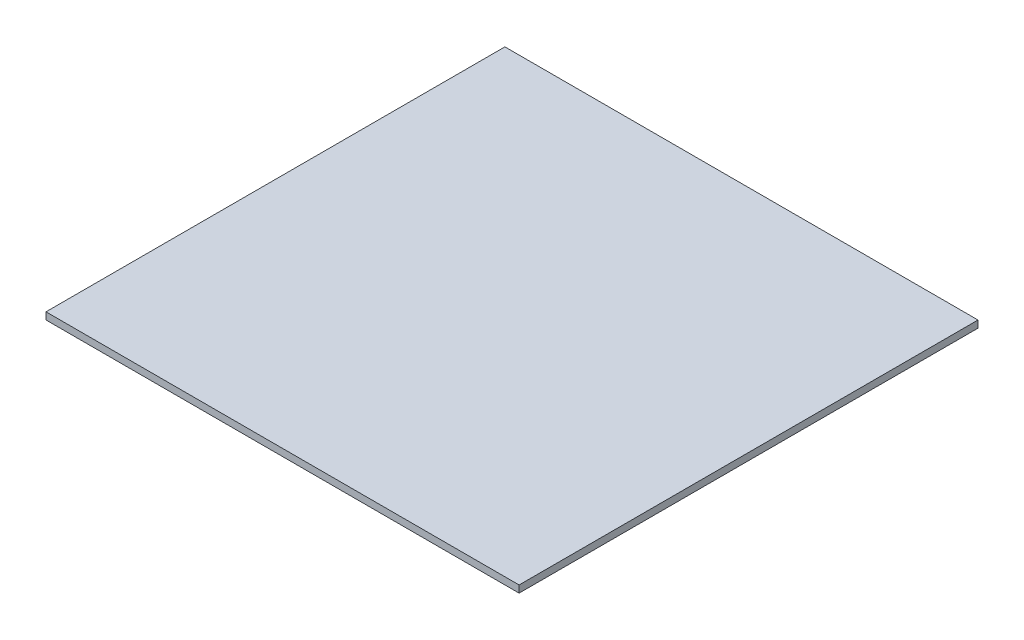
ISO-10303-21;
HEADER;
FILE_DESCRIPTION(('STEP AP214'),'2;1');
FILE_NAME('part.step','',(''),(''),'','','');
FILE_SCHEMA(('AUTOMOTIVE_DESIGN { 1 0 10303 214 1 1 1 1 }'));
ENDSEC;
DATA;
#1=APPLICATION_CONTEXT('core data for automotive mechanical design processes');
#2=APPLICATION_PROTOCOL_DEFINITION('international standard','automotive_design',2000,#1);
#3=PRODUCT_CONTEXT('',#1,'mechanical');
#4=PRODUCT('Part','Part','',(#3));
#5=PRODUCT_RELATED_PRODUCT_CATEGORY('part','',(#4));
#6=PRODUCT_DEFINITION_FORMATION('','',#4);
#7=PRODUCT_DEFINITION_CONTEXT('part definition',#1,'design');
#8=PRODUCT_DEFINITION('design','',#6,#7);
#9=PRODUCT_DEFINITION_SHAPE('','',#8);
#10=(LENGTH_UNIT() NAMED_UNIT(*) SI_UNIT(.MILLI.,.METRE.));
#11=(NAMED_UNIT(*) PLANE_ANGLE_UNIT() SI_UNIT($,.RADIAN.));
#12=(NAMED_UNIT(*) SI_UNIT($,.STERADIAN.) SOLID_ANGLE_UNIT());
#13=UNCERTAINTY_MEASURE_WITH_UNIT(LENGTH_MEASURE(1.E-05),#10,'distance_accuracy_value','');
#14=(GEOMETRIC_REPRESENTATION_CONTEXT(3) GLOBAL_UNCERTAINTY_ASSIGNED_CONTEXT((#13)) GLOBAL_UNIT_ASSIGNED_CONTEXT((#10,
#11,#12)) REPRESENTATION_CONTEXT('',''));
#15=CARTESIAN_POINT('',(0.,0.,0.));
#16=DIRECTION('',(0.,0.,1.));
#17=DIRECTION('',(1.,0.,0.));
#18=AXIS2_PLACEMENT_3D('',#15,#16,#17);
#19=CARTESIAN_POINT('',(0.,3.,0.));
#20=DIRECTION('',(1.,0.,0.));
#21=DIRECTION('',(0.,0.,-1.));
#22=AXIS2_PLACEMENT_3D('',#19,#20,#21);
#23=PLANE('',#22);
#24=DIRECTION('',(0.,0.,1.));
#25=VECTOR('',#24,1.);
#26=CARTESIAN_POINT('',(0.,0.,0.));
#27=LINE('',#26,#25);
#28=CARTESIAN_POINT('',(0.,0.,0.));
#29=VERTEX_POINT('',#28);
#30=CARTESIAN_POINT('',(0.,0.,194.));
#31=VERTEX_POINT('',#30);
#32=EDGE_CURVE('E119',#29,#31,#27,.T.);
#33=ORIENTED_EDGE('',*,*,#32,.T.);
#34=DIRECTION('',(0.,-1.,0.));
#35=VECTOR('',#34,1.);
#36=CARTESIAN_POINT('',(0.,3.,194.));
#37=LINE('',#36,#35);
#38=CARTESIAN_POINT('',(0.,3.,194.));
#39=VERTEX_POINT('',#38);
#40=EDGE_CURVE('E11',#39,#31,#37,.T.);
#41=ORIENTED_EDGE('',*,*,#40,.F.);
#42=DIRECTION('',(0.,0.,1.));
#43=VECTOR('',#42,1.);
#44=CARTESIAN_POINT('',(0.,3.,0.));
#45=LINE('',#44,#43);
#46=CARTESIAN_POINT('',(0.,3.,0.));
#47=VERTEX_POINT('',#46);
#48=EDGE_CURVE('E103',#47,#39,#45,.T.);
#49=ORIENTED_EDGE('',*,*,#48,.F.);
#50=DIRECTION('',(0.,-1.,0.));
#51=VECTOR('',#50,1.);
#52=CARTESIAN_POINT('',(0.,3.,0.));
#53=LINE('',#52,#51);
#54=EDGE_CURVE('E115',#47,#29,#53,.T.);
#55=ORIENTED_EDGE('',*,*,#54,.T.);
#56=EDGE_LOOP('',(#33,#41,#49,#55));
#57=FACE_BOUND('',#56,.T.);
#58=ADVANCED_FACE('F51',(#57),#23,.F.);
#59=CARTESIAN_POINT('',(0.,3.,194.));
#60=DIRECTION('',(0.,0.,-1.));
#61=DIRECTION('',(-1.,0.,0.));
#62=AXIS2_PLACEMENT_3D('',#59,#60,#61);
#63=PLANE('',#62);
#64=DIRECTION('',(1.,0.,0.));
#65=VECTOR('',#64,1.);
#66=CARTESIAN_POINT('',(0.,0.,194.));
#67=LINE('',#66,#65);
#68=CARTESIAN_POINT('',(200.,0.,194.));
#69=VERTEX_POINT('',#68);
#70=EDGE_CURVE('E108',#31,#69,#67,.T.);
#71=ORIENTED_EDGE('',*,*,#70,.T.);
#72=DIRECTION('',(0.,-1.,0.));
#73=VECTOR('',#72,1.);
#74=CARTESIAN_POINT('',(200.,3.,194.));
#75=LINE('',#74,#73);
#76=CARTESIAN_POINT('',(200.,3.,194.));
#77=VERTEX_POINT('',#76);
#78=EDGE_CURVE('E60',#77,#69,#75,.T.);
#79=ORIENTED_EDGE('',*,*,#78,.F.);
#80=DIRECTION('',(1.,0.,0.));
#81=VECTOR('',#80,1.);
#82=CARTESIAN_POINT('',(0.,3.,194.));
#83=LINE('',#82,#81);
#84=EDGE_CURVE('E98',#39,#77,#83,.T.);
#85=ORIENTED_EDGE('',*,*,#84,.F.);
#86=ORIENTED_EDGE('',*,*,#40,.T.);
#87=EDGE_LOOP('',(#71,#79,#85,#86));
#88=FACE_BOUND('',#87,.T.);
#89=ADVANCED_FACE('F107',(#88),#63,.F.);
#90=CARTESIAN_POINT('',(200.,3.,0.));
#91=DIRECTION('',(-1.,0.,0.));
#92=DIRECTION('',(0.,0.,1.));
#93=AXIS2_PLACEMENT_3D('',#90,#91,#92);
#94=PLANE('',#93);
#95=DIRECTION('',(0.,0.,-1.));
#96=VECTOR('',#95,1.);
#97=CARTESIAN_POINT('',(200.,0.,0.));
#98=LINE('',#97,#96);
#99=CARTESIAN_POINT('',(200.,0.,0.));
#100=VERTEX_POINT('',#99);
#101=EDGE_CURVE('E85',#69,#100,#98,.T.);
#102=ORIENTED_EDGE('',*,*,#101,.T.);
#103=DIRECTION('',(0.,-1.,0.));
#104=VECTOR('',#103,1.);
#105=CARTESIAN_POINT('',(200.,3.,0.));
#106=LINE('',#105,#104);
#107=CARTESIAN_POINT('',(200.,3.,0.));
#108=VERTEX_POINT('',#107);
#109=EDGE_CURVE('E110',#108,#100,#106,.T.);
#110=ORIENTED_EDGE('',*,*,#109,.F.);
#111=DIRECTION('',(0.,0.,-1.));
#112=VECTOR('',#111,1.);
#113=CARTESIAN_POINT('',(200.,3.,0.));
#114=LINE('',#113,#112);
#115=EDGE_CURVE('E101',#77,#108,#114,.T.);
#116=ORIENTED_EDGE('',*,*,#115,.F.);
#117=ORIENTED_EDGE('',*,*,#78,.T.);
#118=EDGE_LOOP('',(#102,#110,#116,#117));
#119=FACE_BOUND('',#118,.T.);
#120=ADVANCED_FACE('F111',(#119),#94,.F.);
#121=CARTESIAN_POINT('',(0.,3.,0.));
#122=DIRECTION('',(0.,0.,1.));
#123=DIRECTION('',(1.,0.,0.));
#124=AXIS2_PLACEMENT_3D('',#121,#122,#123);
#125=PLANE('',#124);
#126=DIRECTION('',(-1.,0.,0.));
#127=VECTOR('',#126,1.);
#128=CARTESIAN_POINT('',(0.,0.,0.));
#129=LINE('',#128,#127);
#130=EDGE_CURVE('E91',#100,#29,#129,.T.);
#131=ORIENTED_EDGE('',*,*,#130,.T.);
#132=ORIENTED_EDGE('',*,*,#54,.F.);
#133=DIRECTION('',(-1.,0.,0.));
#134=VECTOR('',#133,1.);
#135=CARTESIAN_POINT('',(0.,3.,0.));
#136=LINE('',#135,#134);
#137=EDGE_CURVE('E68',#108,#47,#136,.T.);
#138=ORIENTED_EDGE('',*,*,#137,.F.);
#139=ORIENTED_EDGE('',*,*,#109,.T.);
#140=EDGE_LOOP('',(#131,#132,#138,#139));
#141=FACE_BOUND('',#140,.T.);
#142=ADVANCED_FACE('F132',(#141),#125,.F.);
#143=CARTESIAN_POINT('',(0.,3.,0.));
#144=DIRECTION('',(0.,1.,0.));
#145=DIRECTION('',(0.,0.,1.));
#146=AXIS2_PLACEMENT_3D('',#143,#144,#145);
#147=PLANE('',#146);
#148=ORIENTED_EDGE('',*,*,#48,.T.);
#149=ORIENTED_EDGE('',*,*,#84,.T.);
#150=ORIENTED_EDGE('',*,*,#115,.T.);
#151=ORIENTED_EDGE('',*,*,#137,.T.);
#152=EDGE_LOOP('',(#148,#149,#150,#151));
#153=FACE_BOUND('',#152,.T.);
#154=ADVANCED_FACE('F99',(#153),#147,.T.);
#155=CARTESIAN_POINT('',(0.,0.,0.));
#156=DIRECTION('',(0.,1.,0.));
#157=DIRECTION('',(0.,0.,1.));
#158=AXIS2_PLACEMENT_3D('',#155,#156,#157);
#159=PLANE('',#158);
#160=ORIENTED_EDGE('',*,*,#32,.F.);
#161=ORIENTED_EDGE('',*,*,#130,.F.);
#162=ORIENTED_EDGE('',*,*,#101,.F.);
#163=ORIENTED_EDGE('',*,*,#70,.F.);
#164=EDGE_LOOP('',(#160,#161,#162,#163));
#165=FACE_BOUND('',#164,.T.);
#166=ADVANCED_FACE('F135',(#165),#159,.F.);
#167=CLOSED_SHELL('',(#58,#89,#120,#142,#154,#166));
#168=MANIFOLD_SOLID_BREP('B2',#167);
#169=ADVANCED_BREP_SHAPE_REPRESENTATION('',(#18,#168),#14);
#170=SHAPE_DEFINITION_REPRESENTATION(#9,#169);
ENDSEC;
END-ISO-10303-21;
